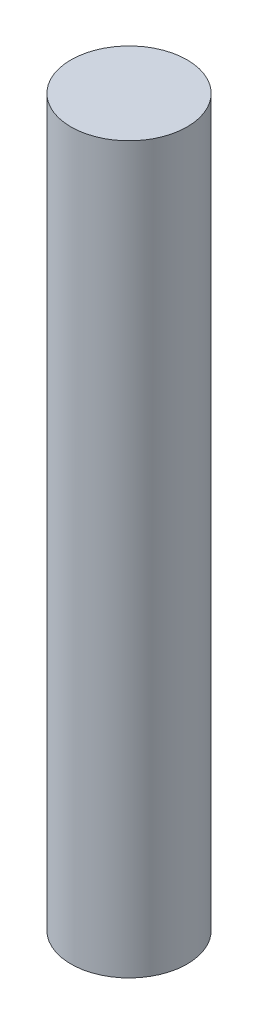
ISO-10303-21;
HEADER;
FILE_DESCRIPTION(('STEP AP214'),'2;1');
FILE_NAME('part.step','',(''),(''),'','','');
FILE_SCHEMA(('AUTOMOTIVE_DESIGN { 1 0 10303 214 1 1 1 1 }'));
ENDSEC;
DATA;
#1=APPLICATION_CONTEXT('core data for automotive mechanical design processes');
#2=APPLICATION_PROTOCOL_DEFINITION('international standard','automotive_design',2000,#1);
#3=PRODUCT_CONTEXT('',#1,'mechanical');
#4=PRODUCT('Part','Part','',(#3));
#5=PRODUCT_RELATED_PRODUCT_CATEGORY('part','',(#4));
#6=PRODUCT_DEFINITION_FORMATION('','',#4);
#7=PRODUCT_DEFINITION_CONTEXT('part definition',#1,'design');
#8=PRODUCT_DEFINITION('design','',#6,#7);
#9=PRODUCT_DEFINITION_SHAPE('','',#8);
#10=(LENGTH_UNIT() NAMED_UNIT(*) SI_UNIT(.MILLI.,.METRE.));
#11=(NAMED_UNIT(*) PLANE_ANGLE_UNIT() SI_UNIT($,.RADIAN.));
#12=(NAMED_UNIT(*) SI_UNIT($,.STERADIAN.) SOLID_ANGLE_UNIT());
#13=UNCERTAINTY_MEASURE_WITH_UNIT(LENGTH_MEASURE(1.E-05),#10,'distance_accuracy_value','');
#14=(GEOMETRIC_REPRESENTATION_CONTEXT(3) GLOBAL_UNCERTAINTY_ASSIGNED_CONTEXT((#13)) GLOBAL_UNIT_ASSIGNED_CONTEXT((#10,
#11,#12)) REPRESENTATION_CONTEXT('',''));
#15=CARTESIAN_POINT('',(0.,0.,0.));
#16=DIRECTION('',(0.,0.,1.));
#17=DIRECTION('',(1.,0.,0.));
#18=AXIS2_PLACEMENT_3D('',#15,#16,#17);
#19=CARTESIAN_POINT('',(0.483549842512392,71.71,0.));
#20=DIRECTION('',(0.,-1.,0.));
#21=DIRECTION('',(0.,0.,-1.));
#22=AXIS2_PLACEMENT_3D('',#19,#20,#21);
#23=CYLINDRICAL_SURFACE('',#22,15.15);
#24=CARTESIAN_POINT('',(0.483549842512392,-94.51,0.));
#25=DIRECTION('',(0.,-1.,0.));
#26=DIRECTION('',(0.,0.,-1.));
#27=AXIS2_PLACEMENT_3D('',#24,#25,#26);
#28=CIRCLE('',#27,15.15);
#29=CARTESIAN_POINT('',(0.483549842512392,-94.51,-15.15));
#30=VERTEX_POINT('',#29);
#31=EDGE_CURVE('E11',#30,#30,#28,.T.);
#32=ORIENTED_EDGE('',*,*,#31,.F.);
#33=EDGE_LOOP('',(#32));
#34=FACE_BOUND('',#33,.T.);
#35=CARTESIAN_POINT('',(0.483549842512392,94.51,0.));
#36=DIRECTION('',(0.,1.,0.));
#37=DIRECTION('',(0.,0.,1.));
#38=AXIS2_PLACEMENT_3D('',#35,#36,#37);
#39=CIRCLE('',#38,15.15);
#40=CARTESIAN_POINT('',(0.483549842512392,94.51,15.15));
#41=VERTEX_POINT('',#40);
#42=EDGE_CURVE('E46',#41,#41,#39,.T.);
#43=ORIENTED_EDGE('',*,*,#42,.F.);
#44=EDGE_LOOP('',(#43));
#45=FACE_BOUND('',#44,.T.);
#46=ADVANCED_FACE('F40',(#34,#45),#23,.T.);
#47=CARTESIAN_POINT('',(0.483549842512392,-94.51,0.));
#48=DIRECTION('',(0.,-1.,0.));
#49=DIRECTION('',(0.,0.,-1.));
#50=AXIS2_PLACEMENT_3D('',#47,#48,#49);
#51=PLANE('',#50);
#52=ORIENTED_EDGE('',*,*,#31,.T.);
#53=EDGE_LOOP('',(#52));
#54=FACE_BOUND('',#53,.T.);
#55=ADVANCED_FACE('F55',(#54),#51,.T.);
#56=CARTESIAN_POINT('',(0.483549842512392,94.51,0.));
#57=DIRECTION('',(0.,1.,0.));
#58=DIRECTION('',(0.,0.,1.));
#59=AXIS2_PLACEMENT_3D('',#56,#57,#58);
#60=PLANE('',#59);
#61=ORIENTED_EDGE('',*,*,#42,.T.);
#62=EDGE_LOOP('',(#61));
#63=FACE_BOUND('',#62,.T.);
#64=ADVANCED_FACE('F52',(#63),#60,.T.);
#65=CLOSED_SHELL('',(#46,#55,#64));
#66=MANIFOLD_SOLID_BREP('B2',#65);
#67=ADVANCED_BREP_SHAPE_REPRESENTATION('',(#18,#66),#14);
#68=SHAPE_DEFINITION_REPRESENTATION(#9,#67);
ENDSEC;
END-ISO-10303-21;
